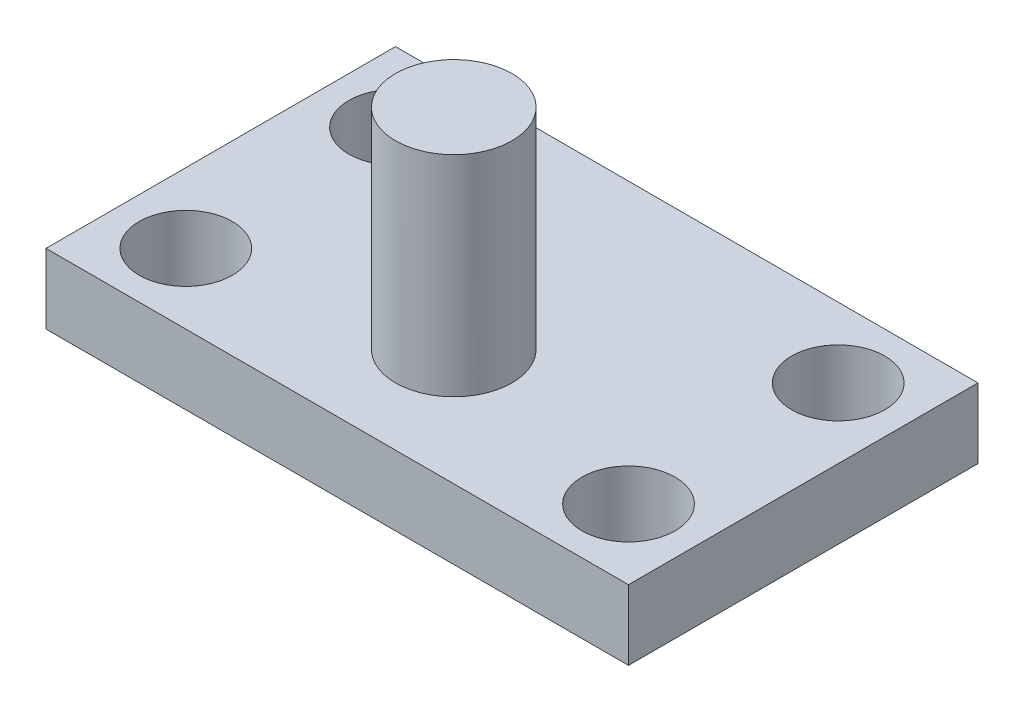
ISO-10303-21;
HEADER;
FILE_DESCRIPTION(('STEP AP214'),'2;1');
FILE_NAME('part.step','',(''),(''),'','','');
FILE_SCHEMA(('AUTOMOTIVE_DESIGN { 1 0 10303 214 1 1 1 1 }'));
ENDSEC;
DATA;
#1=APPLICATION_CONTEXT('core data for automotive mechanical design processes');
#2=APPLICATION_PROTOCOL_DEFINITION('international standard','automotive_design',2000,#1);
#3=PRODUCT_CONTEXT('',#1,'mechanical');
#4=PRODUCT('Part','Part','',(#3));
#5=PRODUCT_RELATED_PRODUCT_CATEGORY('part','',(#4));
#6=PRODUCT_DEFINITION_FORMATION('','',#4);
#7=PRODUCT_DEFINITION_CONTEXT('part definition',#1,'design');
#8=PRODUCT_DEFINITION('design','',#6,#7);
#9=PRODUCT_DEFINITION_SHAPE('','',#8);
#10=(LENGTH_UNIT() NAMED_UNIT(*) SI_UNIT(.MILLI.,.METRE.));
#11=(NAMED_UNIT(*) PLANE_ANGLE_UNIT() SI_UNIT($,.RADIAN.));
#12=(NAMED_UNIT(*) SI_UNIT($,.STERADIAN.) SOLID_ANGLE_UNIT());
#13=UNCERTAINTY_MEASURE_WITH_UNIT(LENGTH_MEASURE(1.E-05),#10,'distance_accuracy_value','');
#14=(GEOMETRIC_REPRESENTATION_CONTEXT(3) GLOBAL_UNCERTAINTY_ASSIGNED_CONTEXT((#13)) GLOBAL_UNIT_ASSIGNED_CONTEXT((#10,
#11,#12)) REPRESENTATION_CONTEXT('',''));
#15=CARTESIAN_POINT('',(0.,0.,0.));
#16=DIRECTION('',(0.,0.,1.));
#17=DIRECTION('',(1.,0.,0.));
#18=AXIS2_PLACEMENT_3D('',#15,#16,#17);
#19=CARTESIAN_POINT('',(0.,30.,0.));
#20=DIRECTION('',(0.,1.,0.));
#21=DIRECTION('',(0.,0.,1.));
#22=AXIS2_PLACEMENT_3D('',#19,#20,#21);
#23=PLANE('',#22);
#24=CARTESIAN_POINT('',(95.,30.,45.));
#25=DIRECTION('',(0.,1.,0.));
#26=DIRECTION('',(0.,0.,-1.));
#27=AXIS2_PLACEMENT_3D('',#24,#25,#26);
#28=CIRCLE('',#27,20.);
#29=CARTESIAN_POINT('',(95.,30.,25.));
#30=VERTEX_POINT('',#29);
#31=EDGE_CURVE('E128',#30,#30,#28,.T.);
#32=ORIENTED_EDGE('',*,*,#31,.F.);
#33=EDGE_LOOP('',(#32));
#34=FACE_BOUND('',#33,.T.);
#35=CARTESIAN_POINT('',(-94.9999999999999,30.,-45.));
#36=DIRECTION('',(0.,1.,0.));
#37=DIRECTION('',(0.,0.,1.));
#38=AXIS2_PLACEMENT_3D('',#35,#36,#37);
#39=CIRCLE('',#38,20.);
#40=CARTESIAN_POINT('',(-94.9999999999999,30.,-25.));
#41=VERTEX_POINT('',#40);
#42=EDGE_CURVE('E118',#41,#41,#39,.T.);
#43=ORIENTED_EDGE('',*,*,#42,.F.);
#44=EDGE_LOOP('',(#43));
#45=FACE_BOUND('',#44,.T.);
#46=DIRECTION('',(0.,0.,-1.));
#47=VECTOR('',#46,1.);
#48=CARTESIAN_POINT('',(125.,30.,-75.));
#49=LINE('',#48,#47);
#50=CARTESIAN_POINT('',(125.,30.,75.));
#51=VERTEX_POINT('',#50);
#52=CARTESIAN_POINT('',(125.,30.,-75.));
#53=VERTEX_POINT('',#52);
#54=EDGE_CURVE('E89',#51,#53,#49,.T.);
#55=ORIENTED_EDGE('',*,*,#54,.T.);
#56=DIRECTION('',(-1.,0.,0.));
#57=VECTOR('',#56,1.);
#58=CARTESIAN_POINT('',(-125.,30.,-75.));
#59=LINE('',#58,#57);
#60=CARTESIAN_POINT('',(-125.,30.,-75.));
#61=VERTEX_POINT('',#60);
#62=EDGE_CURVE('E84',#53,#61,#59,.T.);
#63=ORIENTED_EDGE('',*,*,#62,.T.);
#64=DIRECTION('',(0.,0.,1.));
#65=VECTOR('',#64,1.);
#66=CARTESIAN_POINT('',(-125.,30.,-75.));
#67=LINE('',#66,#65);
#68=CARTESIAN_POINT('',(-125.,30.,75.));
#69=VERTEX_POINT('',#68);
#70=EDGE_CURVE('E87',#61,#69,#67,.T.);
#71=ORIENTED_EDGE('',*,*,#70,.T.);
#72=DIRECTION('',(1.,0.,0.));
#73=VECTOR('',#72,1.);
#74=CARTESIAN_POINT('',(-125.,30.,75.));
#75=LINE('',#74,#73);
#76=EDGE_CURVE('E54',#69,#51,#75,.T.);
#77=ORIENTED_EDGE('',*,*,#76,.T.);
#78=EDGE_LOOP('',(#55,#63,#71,#77));
#79=FACE_BOUND('',#78,.T.);
#80=CARTESIAN_POINT('',(0.,30.,25.));
#81=DIRECTION('',(0.,1.,0.));
#82=DIRECTION('',(0.,0.,1.));
#83=AXIS2_PLACEMENT_3D('',#80,#81,#82);
#84=CIRCLE('',#83,25.);
#85=CARTESIAN_POINT('',(0.,30.,50.));
#86=VERTEX_POINT('',#85);
#87=EDGE_CURVE('E104',#86,#86,#84,.T.);
#88=ORIENTED_EDGE('',*,*,#87,.F.);
#89=EDGE_LOOP('',(#88));
#90=FACE_BOUND('',#89,.T.);
#91=CARTESIAN_POINT('',(-95.,30.,45.));
#92=DIRECTION('',(0.,1.,0.));
#93=DIRECTION('',(0.,0.,1.));
#94=AXIS2_PLACEMENT_3D('',#91,#92,#93);
#95=CIRCLE('',#94,20.);
#96=CARTESIAN_POINT('',(-95.,30.,65.));
#97=VERTEX_POINT('',#96);
#98=EDGE_CURVE('E122',#97,#97,#95,.T.);
#99=ORIENTED_EDGE('',*,*,#98,.F.);
#100=EDGE_LOOP('',(#99));
#101=FACE_BOUND('',#100,.T.);
#102=CARTESIAN_POINT('',(94.9999999999999,30.,-45.));
#103=DIRECTION('',(0.,1.,0.));
#104=DIRECTION('',(0.,0.,-1.));
#105=AXIS2_PLACEMENT_3D('',#102,#103,#104);
#106=CIRCLE('',#105,20.);
#107=CARTESIAN_POINT('',(94.9999999999999,30.,-65.));
#108=VERTEX_POINT('',#107);
#109=EDGE_CURVE('E134',#108,#108,#106,.T.);
#110=ORIENTED_EDGE('',*,*,#109,.F.);
#111=EDGE_LOOP('',(#110));
#112=FACE_BOUND('',#111,.T.);
#113=ADVANCED_FACE('F37',(#34,#45,#79,#90,#101,#112),#23,.T.);
#114=CARTESIAN_POINT('',(0.,0.,0.));
#115=DIRECTION('',(0.,1.,0.));
#116=DIRECTION('',(0.,0.,1.));
#117=AXIS2_PLACEMENT_3D('',#114,#115,#116);
#118=PLANE('',#117);
#119=DIRECTION('',(0.,0.,-1.));
#120=VECTOR('',#119,1.);
#121=CARTESIAN_POINT('',(125.,0.,-75.));
#122=LINE('',#121,#120);
#123=CARTESIAN_POINT('',(125.,0.,75.));
#124=VERTEX_POINT('',#123);
#125=CARTESIAN_POINT('',(125.,0.,-75.));
#126=VERTEX_POINT('',#125);
#127=EDGE_CURVE('E101',#124,#126,#122,.T.);
#128=ORIENTED_EDGE('',*,*,#127,.F.);
#129=DIRECTION('',(1.,0.,0.));
#130=VECTOR('',#129,1.);
#131=CARTESIAN_POINT('',(-125.,0.,75.));
#132=LINE('',#131,#130);
#133=CARTESIAN_POINT('',(-125.,0.,75.));
#134=VERTEX_POINT('',#133);
#135=EDGE_CURVE('E77',#134,#124,#132,.T.);
#136=ORIENTED_EDGE('',*,*,#135,.F.);
#137=DIRECTION('',(0.,0.,1.));
#138=VECTOR('',#137,1.);
#139=CARTESIAN_POINT('',(-125.,0.,-75.));
#140=LINE('',#139,#138);
#141=CARTESIAN_POINT('',(-125.,0.,-75.));
#142=VERTEX_POINT('',#141);
#143=EDGE_CURVE('E71',#142,#134,#140,.T.);
#144=ORIENTED_EDGE('',*,*,#143,.F.);
#145=DIRECTION('',(-1.,0.,0.));
#146=VECTOR('',#145,1.);
#147=CARTESIAN_POINT('',(-125.,0.,-75.));
#148=LINE('',#147,#146);
#149=EDGE_CURVE('E93',#126,#142,#148,.T.);
#150=ORIENTED_EDGE('',*,*,#149,.F.);
#151=EDGE_LOOP('',(#128,#136,#144,#150));
#152=FACE_BOUND('',#151,.T.);
#153=CARTESIAN_POINT('',(-94.9999999999999,0.,-45.));
#154=DIRECTION('',(0.,1.,0.));
#155=DIRECTION('',(0.,0.,1.));
#156=AXIS2_PLACEMENT_3D('',#153,#154,#155);
#157=CIRCLE('',#156,20.);
#158=CARTESIAN_POINT('',(-94.9999999999999,0.,-25.));
#159=VERTEX_POINT('',#158);
#160=EDGE_CURVE('E119',#159,#159,#157,.T.);
#161=ORIENTED_EDGE('',*,*,#160,.T.);
#162=EDGE_LOOP('',(#161));
#163=FACE_BOUND('',#162,.T.);
#164=CARTESIAN_POINT('',(-95.,0.,45.));
#165=DIRECTION('',(0.,1.,0.));
#166=DIRECTION('',(0.,0.,1.));
#167=AXIS2_PLACEMENT_3D('',#164,#165,#166);
#168=CIRCLE('',#167,20.);
#169=CARTESIAN_POINT('',(-95.,0.,65.));
#170=VERTEX_POINT('',#169);
#171=EDGE_CURVE('E125',#170,#170,#168,.T.);
#172=ORIENTED_EDGE('',*,*,#171,.T.);
#173=EDGE_LOOP('',(#172));
#174=FACE_BOUND('',#173,.T.);
#175=CARTESIAN_POINT('',(95.,0.,45.));
#176=DIRECTION('',(0.,1.,0.));
#177=DIRECTION('',(0.,0.,-1.));
#178=AXIS2_PLACEMENT_3D('',#175,#176,#177);
#179=CIRCLE('',#178,20.);
#180=CARTESIAN_POINT('',(95.,0.,25.));
#181=VERTEX_POINT('',#180);
#182=EDGE_CURVE('E131',#181,#181,#179,.T.);
#183=ORIENTED_EDGE('',*,*,#182,.T.);
#184=EDGE_LOOP('',(#183));
#185=FACE_BOUND('',#184,.T.);
#186=CARTESIAN_POINT('',(94.9999999999999,0.,-45.));
#187=DIRECTION('',(0.,1.,0.));
#188=DIRECTION('',(0.,0.,-1.));
#189=AXIS2_PLACEMENT_3D('',#186,#187,#188);
#190=CIRCLE('',#189,20.);
#191=CARTESIAN_POINT('',(94.9999999999999,0.,-65.));
#192=VERTEX_POINT('',#191);
#193=EDGE_CURVE('E137',#192,#192,#190,.T.);
#194=ORIENTED_EDGE('',*,*,#193,.T.);
#195=EDGE_LOOP('',(#194));
#196=FACE_BOUND('',#195,.T.);
#197=ADVANCED_FACE('F112',(#152,#163,#174,#185,#196),#118,.F.);
#198=CARTESIAN_POINT('',(125.,30.,-75.));
#199=DIRECTION('',(-1.,0.,0.));
#200=DIRECTION('',(0.,0.,1.));
#201=AXIS2_PLACEMENT_3D('',#198,#199,#200);
#202=PLANE('',#201);
#203=ORIENTED_EDGE('',*,*,#127,.T.);
#204=DIRECTION('',(0.,-1.,0.));
#205=VECTOR('',#204,1.);
#206=CARTESIAN_POINT('',(125.,30.,-75.));
#207=LINE('',#206,#205);
#208=EDGE_CURVE('E11',#53,#126,#207,.T.);
#209=ORIENTED_EDGE('',*,*,#208,.F.);
#210=ORIENTED_EDGE('',*,*,#54,.F.);
#211=DIRECTION('',(0.,-1.,0.));
#212=VECTOR('',#211,1.);
#213=CARTESIAN_POINT('',(125.,30.,75.));
#214=LINE('',#213,#212);
#215=EDGE_CURVE('E97',#51,#124,#214,.T.);
#216=ORIENTED_EDGE('',*,*,#215,.T.);
#217=EDGE_LOOP('',(#203,#209,#210,#216));
#218=FACE_BOUND('',#217,.T.);
#219=ADVANCED_FACE('F39',(#218),#202,.F.);
#220=CARTESIAN_POINT('',(-125.,30.,-75.));
#221=DIRECTION('',(0.,0.,1.));
#222=DIRECTION('',(1.,0.,0.));
#223=AXIS2_PLACEMENT_3D('',#220,#221,#222);
#224=PLANE('',#223);
#225=ORIENTED_EDGE('',*,*,#149,.T.);
#226=DIRECTION('',(0.,-1.,0.));
#227=VECTOR('',#226,1.);
#228=CARTESIAN_POINT('',(-125.,30.,-75.));
#229=LINE('',#228,#227);
#230=EDGE_CURVE('E46',#61,#142,#229,.T.);
#231=ORIENTED_EDGE('',*,*,#230,.F.);
#232=ORIENTED_EDGE('',*,*,#62,.F.);
#233=ORIENTED_EDGE('',*,*,#208,.T.);
#234=EDGE_LOOP('',(#225,#231,#232,#233));
#235=FACE_BOUND('',#234,.T.);
#236=ADVANCED_FACE('F92',(#235),#224,.F.);
#237=CARTESIAN_POINT('',(-125.,30.,-75.));
#238=DIRECTION('',(1.,0.,0.));
#239=DIRECTION('',(0.,0.,-1.));
#240=AXIS2_PLACEMENT_3D('',#237,#238,#239);
#241=PLANE('',#240);
#242=ORIENTED_EDGE('',*,*,#143,.T.);
#243=DIRECTION('',(0.,-1.,0.));
#244=VECTOR('',#243,1.);
#245=CARTESIAN_POINT('',(-125.,30.,75.));
#246=LINE('',#245,#244);
#247=EDGE_CURVE('E94',#69,#134,#246,.T.);
#248=ORIENTED_EDGE('',*,*,#247,.F.);
#249=ORIENTED_EDGE('',*,*,#70,.F.);
#250=ORIENTED_EDGE('',*,*,#230,.T.);
#251=EDGE_LOOP('',(#242,#248,#249,#250));
#252=FACE_BOUND('',#251,.T.);
#253=ADVANCED_FACE('F95',(#252),#241,.F.);
#254=CARTESIAN_POINT('',(-125.,30.,75.));
#255=DIRECTION('',(0.,0.,-1.));
#256=DIRECTION('',(-1.,0.,0.));
#257=AXIS2_PLACEMENT_3D('',#254,#255,#256);
#258=PLANE('',#257);
#259=ORIENTED_EDGE('',*,*,#135,.T.);
#260=ORIENTED_EDGE('',*,*,#215,.F.);
#261=ORIENTED_EDGE('',*,*,#76,.F.);
#262=ORIENTED_EDGE('',*,*,#247,.T.);
#263=EDGE_LOOP('',(#259,#260,#261,#262));
#264=FACE_BOUND('',#263,.T.);
#265=ADVANCED_FACE('F109',(#264),#258,.F.);
#266=CARTESIAN_POINT('',(-94.9999999999999,30.,-45.));
#267=DIRECTION('',(0.,-1.,0.));
#268=DIRECTION('',(0.,0.,-1.));
#269=AXIS2_PLACEMENT_3D('',#266,#267,#268);
#270=CYLINDRICAL_SURFACE('',#269,20.);
#271=ORIENTED_EDGE('',*,*,#42,.T.);
#272=EDGE_LOOP('',(#271));
#273=FACE_BOUND('',#272,.T.);
#274=ORIENTED_EDGE('',*,*,#160,.F.);
#275=EDGE_LOOP('',(#274));
#276=FACE_BOUND('',#275,.T.);
#277=ADVANCED_FACE('F167',(#273,#276),#270,.F.);
#278=CARTESIAN_POINT('',(-95.,30.,45.));
#279=DIRECTION('',(0.,-1.,0.));
#280=DIRECTION('',(0.,0.,-1.));
#281=AXIS2_PLACEMENT_3D('',#278,#279,#280);
#282=CYLINDRICAL_SURFACE('',#281,20.);
#283=ORIENTED_EDGE('',*,*,#98,.T.);
#284=EDGE_LOOP('',(#283));
#285=FACE_BOUND('',#284,.T.);
#286=ORIENTED_EDGE('',*,*,#171,.F.);
#287=EDGE_LOOP('',(#286));
#288=FACE_BOUND('',#287,.T.);
#289=ADVANCED_FACE('F219',(#285,#288),#282,.F.);
#290=CARTESIAN_POINT('',(95.,30.,45.));
#291=DIRECTION('',(0.,-1.,0.));
#292=DIRECTION('',(0.,0.,-1.));
#293=AXIS2_PLACEMENT_3D('',#290,#291,#292);
#294=CYLINDRICAL_SURFACE('',#293,20.);
#295=ORIENTED_EDGE('',*,*,#31,.T.);
#296=EDGE_LOOP('',(#295));
#297=FACE_BOUND('',#296,.T.);
#298=ORIENTED_EDGE('',*,*,#182,.F.);
#299=EDGE_LOOP('',(#298));
#300=FACE_BOUND('',#299,.T.);
#301=ADVANCED_FACE('F210',(#297,#300),#294,.F.);
#302=CARTESIAN_POINT('',(94.9999999999999,30.,-45.));
#303=DIRECTION('',(0.,-1.,0.));
#304=DIRECTION('',(0.,0.,-1.));
#305=AXIS2_PLACEMENT_3D('',#302,#303,#304);
#306=CYLINDRICAL_SURFACE('',#305,20.);
#307=ORIENTED_EDGE('',*,*,#109,.T.);
#308=EDGE_LOOP('',(#307));
#309=FACE_BOUND('',#308,.T.);
#310=ORIENTED_EDGE('',*,*,#193,.F.);
#311=EDGE_LOOP('',(#310));
#312=FACE_BOUND('',#311,.T.);
#313=ADVANCED_FACE('F154',(#309,#312),#306,.F.);
#314=CARTESIAN_POINT('',(0.,120.,25.));
#315=DIRECTION('',(0.,-1.,0.));
#316=DIRECTION('',(0.,0.,-1.));
#317=AXIS2_PLACEMENT_3D('',#314,#315,#316);
#318=CYLINDRICAL_SURFACE('',#317,25.);
#319=ORIENTED_EDGE('',*,*,#87,.T.);
#320=EDGE_LOOP('',(#319));
#321=FACE_BOUND('',#320,.T.);
#322=CARTESIAN_POINT('',(0.,120.,25.));
#323=DIRECTION('',(0.,-1.,0.));
#324=DIRECTION('',(0.,0.,-1.));
#325=AXIS2_PLACEMENT_3D('',#322,#323,#324);
#326=CIRCLE('',#325,25.);
#327=CARTESIAN_POINT('',(0.,120.,0.));
#328=VERTEX_POINT('',#327);
#329=EDGE_CURVE('E140',#328,#328,#326,.T.);
#330=ORIENTED_EDGE('',*,*,#329,.T.);
#331=EDGE_LOOP('',(#330));
#332=FACE_BOUND('',#331,.T.);
#333=ADVANCED_FACE('F146',(#321,#332),#318,.T.);
#334=CARTESIAN_POINT('',(0.,120.,25.));
#335=DIRECTION('',(0.,-1.,0.));
#336=DIRECTION('',(0.,0.,-1.));
#337=AXIS2_PLACEMENT_3D('',#334,#335,#336);
#338=PLANE('',#337);
#339=ORIENTED_EDGE('',*,*,#329,.F.);
#340=EDGE_LOOP('',(#339));
#341=FACE_BOUND('',#340,.T.);
#342=ADVANCED_FACE('F148',(#341),#338,.F.);
#343=CLOSED_SHELL('',(#113,#197,#219,#236,#253,#265,#277,#289,#301,#313,#333,#342));
#344=MANIFOLD_SOLID_BREP('B2',#343);
#345=ADVANCED_BREP_SHAPE_REPRESENTATION('',(#18,#344),#14);
#346=SHAPE_DEFINITION_REPRESENTATION(#9,#345);
ENDSEC;
END-ISO-10303-21;
